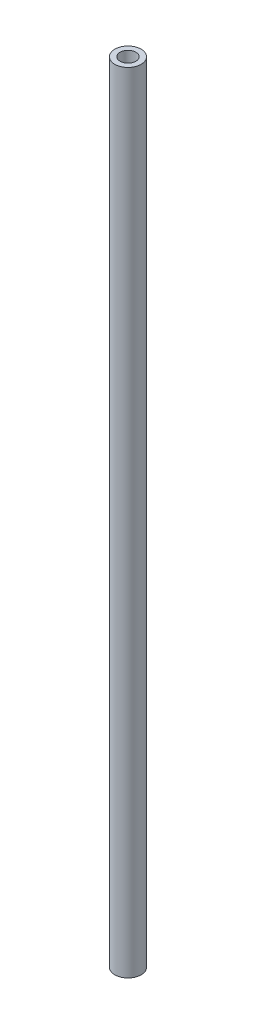
ISO-10303-21;
HEADER;
FILE_DESCRIPTION(('STEP AP214'),'2;1');
FILE_NAME('part.step','',(''),(''),'','','');
FILE_SCHEMA(('AUTOMOTIVE_DESIGN { 1 0 10303 214 1 1 1 1 }'));
ENDSEC;
DATA;
#1=APPLICATION_CONTEXT('core data for automotive mechanical design processes');
#2=APPLICATION_PROTOCOL_DEFINITION('international standard','automotive_design',2000,#1);
#3=PRODUCT_CONTEXT('',#1,'mechanical');
#4=PRODUCT('Part','Part','',(#3));
#5=PRODUCT_RELATED_PRODUCT_CATEGORY('part','',(#4));
#6=PRODUCT_DEFINITION_FORMATION('','',#4);
#7=PRODUCT_DEFINITION_CONTEXT('part definition',#1,'design');
#8=PRODUCT_DEFINITION('design','',#6,#7);
#9=PRODUCT_DEFINITION_SHAPE('','',#8);
#10=(LENGTH_UNIT() NAMED_UNIT(*) SI_UNIT(.MILLI.,.METRE.));
#11=(NAMED_UNIT(*) PLANE_ANGLE_UNIT() SI_UNIT($,.RADIAN.));
#12=(NAMED_UNIT(*) SI_UNIT($,.STERADIAN.) SOLID_ANGLE_UNIT());
#13=UNCERTAINTY_MEASURE_WITH_UNIT(LENGTH_MEASURE(1.E-05),#10,'distance_accuracy_value','');
#14=(GEOMETRIC_REPRESENTATION_CONTEXT(3) GLOBAL_UNCERTAINTY_ASSIGNED_CONTEXT((#13)) GLOBAL_UNIT_ASSIGNED_CONTEXT((#10,
#11,#12)) REPRESENTATION_CONTEXT('',''));
#15=CARTESIAN_POINT('',(0.,0.,0.));
#16=DIRECTION('',(0.,0.,1.));
#17=DIRECTION('',(1.,0.,0.));
#18=AXIS2_PLACEMENT_3D('',#15,#16,#17);
#19=CARTESIAN_POINT('',(0.,150.,0.));
#20=DIRECTION('',(0.,-1.,0.));
#21=DIRECTION('',(0.,0.,-1.));
#22=AXIS2_PLACEMENT_3D('',#19,#20,#21);
#23=CYLINDRICAL_SURFACE('',#22,5.);
#24=CARTESIAN_POINT('',(0.,150.,0.));
#25=DIRECTION('',(0.,1.,0.));
#26=DIRECTION('',(0.,0.,1.));
#27=AXIS2_PLACEMENT_3D('',#24,#25,#26);
#28=CIRCLE('',#27,5.);
#29=CARTESIAN_POINT('',(0.,150.,5.));
#30=VERTEX_POINT('',#29);
#31=EDGE_CURVE('E10',#30,#30,#28,.T.);
#32=ORIENTED_EDGE('',*,*,#31,.F.);
#33=EDGE_LOOP('',(#32));
#34=FACE_BOUND('',#33,.T.);
#35=CARTESIAN_POINT('',(0.,-150.,0.));
#36=DIRECTION('',(0.,1.,0.));
#37=DIRECTION('',(0.,0.,1.));
#38=AXIS2_PLACEMENT_3D('',#35,#36,#37);
#39=CIRCLE('',#38,5.);
#40=CARTESIAN_POINT('',(0.,-150.,5.));
#41=VERTEX_POINT('',#40);
#42=EDGE_CURVE('E38',#41,#41,#39,.T.);
#43=ORIENTED_EDGE('',*,*,#42,.T.);
#44=EDGE_LOOP('',(#43));
#45=FACE_BOUND('',#44,.T.);
#46=ADVANCED_FACE('F35',(#34,#45),#23,.T.);
#47=CARTESIAN_POINT('',(0.,150.,0.));
#48=DIRECTION('',(0.,1.,0.));
#49=DIRECTION('',(0.,0.,1.));
#50=AXIS2_PLACEMENT_3D('',#47,#48,#49);
#51=PLANE('',#50);
#52=CARTESIAN_POINT('',(0.,150.,0.));
#53=DIRECTION('',(0.,1.,0.));
#54=DIRECTION('',(0.,0.,1.));
#55=AXIS2_PLACEMENT_3D('',#52,#53,#54);
#56=CIRCLE('',#55,3.);
#57=CARTESIAN_POINT('',(0.,150.,3.));
#58=VERTEX_POINT('',#57);
#59=EDGE_CURVE('E47',#58,#58,#56,.T.);
#60=ORIENTED_EDGE('',*,*,#59,.F.);
#61=EDGE_LOOP('',(#60));
#62=FACE_BOUND('',#61,.T.);
#63=ORIENTED_EDGE('',*,*,#31,.T.);
#64=EDGE_LOOP('',(#63));
#65=FACE_BOUND('',#64,.T.);
#66=ADVANCED_FACE('F62',(#62,#65),#51,.T.);
#67=CARTESIAN_POINT('',(0.,-150.,0.));
#68=DIRECTION('',(0.,1.,0.));
#69=DIRECTION('',(0.,0.,1.));
#70=AXIS2_PLACEMENT_3D('',#67,#68,#69);
#71=PLANE('',#70);
#72=CARTESIAN_POINT('',(0.,-150.,0.));
#73=DIRECTION('',(0.,1.,0.));
#74=DIRECTION('',(0.,0.,1.));
#75=AXIS2_PLACEMENT_3D('',#72,#73,#74);
#76=CIRCLE('',#75,3.);
#77=CARTESIAN_POINT('',(0.,-150.,3.));
#78=VERTEX_POINT('',#77);
#79=EDGE_CURVE('E45',#78,#78,#76,.T.);
#80=ORIENTED_EDGE('',*,*,#79,.T.);
#81=EDGE_LOOP('',(#80));
#82=FACE_BOUND('',#81,.T.);
#83=ORIENTED_EDGE('',*,*,#42,.F.);
#84=EDGE_LOOP('',(#83));
#85=FACE_BOUND('',#84,.T.);
#86=ADVANCED_FACE('F53',(#82,#85),#71,.F.);
#87=CARTESIAN_POINT('',(0.,-150.,0.));
#88=DIRECTION('',(0.,1.,0.));
#89=DIRECTION('',(0.,0.,1.));
#90=AXIS2_PLACEMENT_3D('',#87,#88,#89);
#91=CYLINDRICAL_SURFACE('',#90,3.);
#92=ORIENTED_EDGE('',*,*,#79,.F.);
#93=EDGE_LOOP('',(#92));
#94=FACE_BOUND('',#93,.T.);
#95=ORIENTED_EDGE('',*,*,#59,.T.);
#96=EDGE_LOOP('',(#95));
#97=FACE_BOUND('',#96,.T.);
#98=ADVANCED_FACE('F56',(#94,#97),#91,.F.);
#99=CLOSED_SHELL('',(#46,#66,#86,#98));
#100=MANIFOLD_SOLID_BREP('B2',#99);
#101=ADVANCED_BREP_SHAPE_REPRESENTATION('',(#18,#100),#14);
#102=SHAPE_DEFINITION_REPRESENTATION(#9,#101);
ENDSEC;
END-ISO-10303-21;
